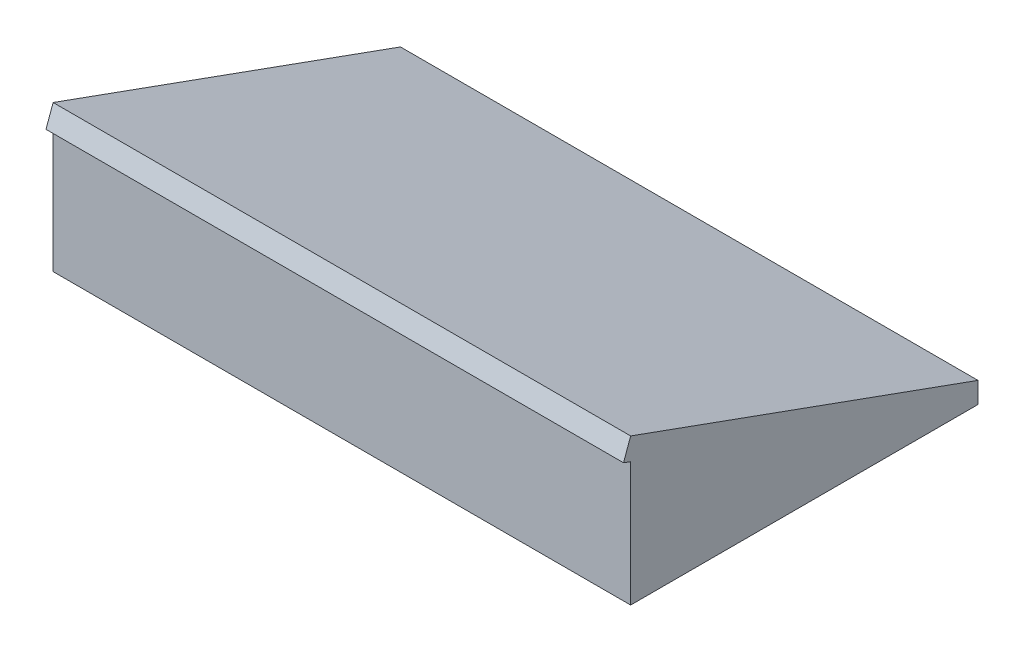
ISO-10303-21;
HEADER;
FILE_DESCRIPTION(('STEP AP214'),'2;1');
FILE_NAME('part.step','',(''),(''),'','','');
FILE_SCHEMA(('AUTOMOTIVE_DESIGN { 1 0 10303 214 1 1 1 1 }'));
ENDSEC;
DATA;
#1=APPLICATION_CONTEXT('core data for automotive mechanical design processes');
#2=APPLICATION_PROTOCOL_DEFINITION('international standard','automotive_design',2000,#1);
#3=PRODUCT_CONTEXT('',#1,'mechanical');
#4=PRODUCT('Part','Part','',(#3));
#5=PRODUCT_RELATED_PRODUCT_CATEGORY('part','',(#4));
#6=PRODUCT_DEFINITION_FORMATION('','',#4);
#7=PRODUCT_DEFINITION_CONTEXT('part definition',#1,'design');
#8=PRODUCT_DEFINITION('design','',#6,#7);
#9=PRODUCT_DEFINITION_SHAPE('','',#8);
#10=(LENGTH_UNIT() NAMED_UNIT(*) SI_UNIT(.MILLI.,.METRE.));
#11=(NAMED_UNIT(*) PLANE_ANGLE_UNIT() SI_UNIT($,.RADIAN.));
#12=(NAMED_UNIT(*) SI_UNIT($,.STERADIAN.) SOLID_ANGLE_UNIT());
#13=UNCERTAINTY_MEASURE_WITH_UNIT(LENGTH_MEASURE(1.E-05),#10,'distance_accuracy_value','');
#14=(GEOMETRIC_REPRESENTATION_CONTEXT(3) GLOBAL_UNCERTAINTY_ASSIGNED_CONTEXT((#13)) GLOBAL_UNIT_ASSIGNED_CONTEXT((#10,
#11,#12)) REPRESENTATION_CONTEXT('',''));
#15=CARTESIAN_POINT('',(0.,0.,0.));
#16=DIRECTION('',(0.,0.,1.));
#17=DIRECTION('',(1.,0.,0.));
#18=AXIS2_PLACEMENT_3D('',#15,#16,#17);
#19=CARTESIAN_POINT('',(64.,5.,41.5));
#20=DIRECTION('',(0.,0.,1.));
#21=DIRECTION('',(1.,0.,0.));
#22=AXIS2_PLACEMENT_3D('',#19,#20,#21);
#23=PLANE('',#22);
#24=DIRECTION('',(0.,-1.,0.));
#25=VECTOR('',#24,1.);
#26=CARTESIAN_POINT('',(69.,5.,41.5));
#27=LINE('',#26,#25);
#28=CARTESIAN_POINT('',(69.,29.6834149725969,41.5));
#29=VERTEX_POINT('',#28);
#30=CARTESIAN_POINT('',(69.,0.,41.5));
#31=VERTEX_POINT('',#30);
#32=EDGE_CURVE('E174',#29,#31,#27,.T.);
#33=ORIENTED_EDGE('',*,*,#32,.F.);
#34=DIRECTION('',(-1.,0.,0.));
#35=VECTOR('',#34,1.);
#36=CARTESIAN_POINT('',(64.,29.6834149725969,41.5));
#37=LINE('',#36,#35);
#38=CARTESIAN_POINT('',(-69.,29.6834149725969,41.5));
#39=VERTEX_POINT('',#38);
#40=EDGE_CURVE('E138',#29,#39,#37,.T.);
#41=ORIENTED_EDGE('',*,*,#40,.T.);
#42=DIRECTION('',(0.,-1.,0.));
#43=VECTOR('',#42,1.);
#44=CARTESIAN_POINT('',(-69.,5.,41.5));
#45=LINE('',#44,#43);
#46=CARTESIAN_POINT('',(-69.,0.,41.5));
#47=VERTEX_POINT('',#46);
#48=EDGE_CURVE('E113',#39,#47,#45,.T.);
#49=ORIENTED_EDGE('',*,*,#48,.T.);
#50=DIRECTION('',(1.,0.,0.));
#51=VECTOR('',#50,1.);
#52=CARTESIAN_POINT('',(-69.,0.,41.5));
#53=LINE('',#52,#51);
#54=EDGE_CURVE('E151',#47,#31,#53,.T.);
#55=ORIENTED_EDGE('',*,*,#54,.T.);
#56=EDGE_LOOP('',(#33,#41,#49,#55));
#57=FACE_BOUND('',#56,.T.);
#58=ADVANCED_FACE('F34',(#57),#23,.T.);
#59=CARTESIAN_POINT('',(64.,35.,41.5));
#60=DIRECTION('',(0.,0.940453312460655,-0.339922884021923));
#61=DIRECTION('',(0.,0.339922884021923,0.940453312460655));
#62=AXIS2_PLACEMENT_3D('',#59,#60,#61);
#63=PLANE('',#62);
#64=DIRECTION('',(0.,0.339922884021923,0.940453312460655));
#65=VECTOR('',#64,1.);
#66=CARTESIAN_POINT('',(69.,35.,41.5));
#67=LINE('',#66,#65);
#68=CARTESIAN_POINT('',(69.,5.,-41.5));
#69=VERTEX_POINT('',#68);
#70=CARTESIAN_POINT('',(69.,35.,41.5));
#71=VERTEX_POINT('',#70);
#72=EDGE_CURVE('E57',#69,#71,#67,.T.);
#73=ORIENTED_EDGE('',*,*,#72,.F.);
#74=DIRECTION('',(1.,0.,0.));
#75=VECTOR('',#74,1.);
#76=CARTESIAN_POINT('',(64.,5.,-41.5));
#77=LINE('',#76,#75);
#78=CARTESIAN_POINT('',(-69.,5.,-41.5));
#79=VERTEX_POINT('',#78);
#80=EDGE_CURVE('E173',#79,#69,#77,.T.);
#81=ORIENTED_EDGE('',*,*,#80,.F.);
#82=DIRECTION('',(0.,-0.339922884021923,-0.940453312460655));
#83=VECTOR('',#82,1.);
#84=CARTESIAN_POINT('',(-69.,35.,41.5));
#85=LINE('',#84,#83);
#86=CARTESIAN_POINT('',(-69.,35.,41.5));
#87=VERTEX_POINT('',#86);
#88=EDGE_CURVE('E140',#87,#79,#85,.T.);
#89=ORIENTED_EDGE('',*,*,#88,.F.);
#90=DIRECTION('',(1.,0.,0.));
#91=VECTOR('',#90,1.);
#92=CARTESIAN_POINT('',(64.,35.,41.5));
#93=LINE('',#92,#91);
#94=EDGE_CURVE('E43',#87,#71,#93,.T.);
#95=ORIENTED_EDGE('',*,*,#94,.T.);
#96=EDGE_LOOP('',(#73,#81,#89,#95));
#97=FACE_BOUND('',#96,.T.);
#98=ADVANCED_FACE('F36',(#97),#63,.T.);
#99=CARTESIAN_POINT('',(69.,0.,0.));
#100=DIRECTION('',(-1.,0.,0.));
#101=DIRECTION('',(0.,0.,1.));
#102=AXIS2_PLACEMENT_3D('',#99,#100,#101);
#103=PLANE('',#102);
#104=DIRECTION('',(0.,-1.,0.));
#105=VECTOR('',#104,1.);
#106=CARTESIAN_POINT('',(69.,5.,-41.5));
#107=LINE('',#106,#105);
#108=CARTESIAN_POINT('',(69.,0.,-41.5));
#109=VERTEX_POINT('',#108);
#110=EDGE_CURVE('E158',#69,#109,#107,.T.);
#111=ORIENTED_EDGE('',*,*,#110,.F.);
#112=ORIENTED_EDGE('',*,*,#72,.T.);
#113=DIRECTION('',(0.,0.940453312460655,-0.339922884021923));
#114=VECTOR('',#113,1.);
#115=CARTESIAN_POINT('',(69.,30.2977334376967,43.1996144201096));
#116=LINE('',#115,#114);
#117=CARTESIAN_POINT('',(69.,30.2977334376967,43.1996144201096));
#118=VERTEX_POINT('',#117);
#119=EDGE_CURVE('E123',#118,#71,#116,.T.);
#120=ORIENTED_EDGE('',*,*,#119,.F.);
#121=DIRECTION('',(0.,-0.339922884021923,-0.940453312460655));
#122=VECTOR('',#121,1.);
#123=CARTESIAN_POINT('',(69.,30.2977334376967,43.1996144201096));
#124=LINE('',#123,#122);
#125=EDGE_CURVE('E118',#118,#29,#124,.T.);
#126=ORIENTED_EDGE('',*,*,#125,.T.);
#127=ORIENTED_EDGE('',*,*,#32,.T.);
#128=DIRECTION('',(0.,0.,-1.));
#129=VECTOR('',#128,1.);
#130=CARTESIAN_POINT('',(69.,0.,41.5));
#131=LINE('',#130,#129);
#132=EDGE_CURVE('E143',#31,#109,#131,.T.);
#133=ORIENTED_EDGE('',*,*,#132,.T.);
#134=EDGE_LOOP('',(#111,#112,#120,#126,#127,#133));
#135=FACE_BOUND('',#134,.T.);
#136=ADVANCED_FACE('F182',(#135),#103,.F.);
#137=CARTESIAN_POINT('',(-69.,5.,-41.5));
#138=DIRECTION('',(0.,0.,1.));
#139=DIRECTION('',(1.,0.,0.));
#140=AXIS2_PLACEMENT_3D('',#137,#138,#139);
#141=PLANE('',#140);
#142=DIRECTION('',(-1.,0.,0.));
#143=VECTOR('',#142,1.);
#144=CARTESIAN_POINT('',(-69.,0.,-41.5));
#145=LINE('',#144,#143);
#146=CARTESIAN_POINT('',(-69.,0.,-41.5));
#147=VERTEX_POINT('',#146);
#148=EDGE_CURVE('E147',#109,#147,#145,.T.);
#149=ORIENTED_EDGE('',*,*,#148,.T.);
#150=DIRECTION('',(0.,-1.,0.));
#151=VECTOR('',#150,1.);
#152=CARTESIAN_POINT('',(-69.,5.,-41.5));
#153=LINE('',#152,#151);
#154=EDGE_CURVE('E155',#79,#147,#153,.T.);
#155=ORIENTED_EDGE('',*,*,#154,.F.);
#156=ORIENTED_EDGE('',*,*,#80,.T.);
#157=ORIENTED_EDGE('',*,*,#110,.T.);
#158=EDGE_LOOP('',(#149,#155,#156,#157));
#159=FACE_BOUND('',#158,.T.);
#160=ADVANCED_FACE('F180',(#159),#141,.F.);
#161=CARTESIAN_POINT('',(-69.,5.,41.5));
#162=DIRECTION('',(1.,0.,0.));
#163=DIRECTION('',(0.,0.,-1.));
#164=AXIS2_PLACEMENT_3D('',#161,#162,#163);
#165=PLANE('',#164);
#166=ORIENTED_EDGE('',*,*,#88,.T.);
#167=ORIENTED_EDGE('',*,*,#154,.T.);
#168=DIRECTION('',(0.,0.,1.));
#169=VECTOR('',#168,1.);
#170=CARTESIAN_POINT('',(-69.,0.,41.5));
#171=LINE('',#170,#169);
#172=EDGE_CURVE('E149',#147,#47,#171,.T.);
#173=ORIENTED_EDGE('',*,*,#172,.T.);
#174=ORIENTED_EDGE('',*,*,#48,.F.);
#175=DIRECTION('',(0.,0.339922884021923,0.940453312460655));
#176=VECTOR('',#175,1.);
#177=CARTESIAN_POINT('',(-69.,30.2977334376967,43.1996144201096));
#178=LINE('',#177,#176);
#179=CARTESIAN_POINT('',(-69.,30.2977334376967,43.1996144201096));
#180=VERTEX_POINT('',#179);
#181=EDGE_CURVE('E106',#39,#180,#178,.T.);
#182=ORIENTED_EDGE('',*,*,#181,.T.);
#183=DIRECTION('',(0.,0.940453312460655,-0.339922884021923));
#184=VECTOR('',#183,1.);
#185=CARTESIAN_POINT('',(-69.,30.2977334376967,43.1996144201096));
#186=LINE('',#185,#184);
#187=EDGE_CURVE('E110',#180,#87,#186,.T.);
#188=ORIENTED_EDGE('',*,*,#187,.T.);
#189=EDGE_LOOP('',(#166,#167,#173,#174,#182,#188));
#190=FACE_BOUND('',#189,.T.);
#191=ADVANCED_FACE('F109',(#190),#165,.F.);
#192=CARTESIAN_POINT('',(0.,0.,0.));
#193=DIRECTION('',(0.,-1.,0.));
#194=DIRECTION('',(0.,0.,-1.));
#195=AXIS2_PLACEMENT_3D('',#192,#193,#194);
#196=PLANE('',#195);
#197=ORIENTED_EDGE('',*,*,#132,.F.);
#198=ORIENTED_EDGE('',*,*,#54,.F.);
#199=ORIENTED_EDGE('',*,*,#172,.F.);
#200=ORIENTED_EDGE('',*,*,#148,.F.);
#201=EDGE_LOOP('',(#197,#198,#199,#200));
#202=FACE_BOUND('',#201,.T.);
#203=ADVANCED_FACE('F187',(#202),#196,.T.);
#204=CARTESIAN_POINT('',(69.,30.2977334376967,43.1996144201096));
#205=DIRECTION('',(0.,0.339922884021923,0.940453312460655));
#206=DIRECTION('',(0.,-0.940453312460655,0.339922884021923));
#207=AXIS2_PLACEMENT_3D('',#204,#205,#206);
#208=PLANE('',#207);
#209=ORIENTED_EDGE('',*,*,#94,.F.);
#210=ORIENTED_EDGE('',*,*,#187,.F.);
#211=DIRECTION('',(1.,0.,0.));
#212=VECTOR('',#211,1.);
#213=CARTESIAN_POINT('',(69.,30.2977334376967,43.1996144201096));
#214=LINE('',#213,#212);
#215=EDGE_CURVE('E117',#180,#118,#214,.T.);
#216=ORIENTED_EDGE('',*,*,#215,.T.);
#217=ORIENTED_EDGE('',*,*,#119,.T.);
#218=EDGE_LOOP('',(#209,#210,#216,#217));
#219=FACE_BOUND('',#218,.T.);
#220=ADVANCED_FACE('F122',(#219),#208,.T.);
#221=CARTESIAN_POINT('',(0.,12.9867820960611,-4.69401762508232));
#222=DIRECTION('',(0.,0.940453312460655,-0.339922884021923));
#223=DIRECTION('',(0.,0.339922884021923,0.940453312460655));
#224=AXIS2_PLACEMENT_3D('',#221,#222,#223);
#225=PLANE('',#224);
#226=ORIENTED_EDGE('',*,*,#40,.F.);
#227=ORIENTED_EDGE('',*,*,#125,.F.);
#228=ORIENTED_EDGE('',*,*,#215,.F.);
#229=ORIENTED_EDGE('',*,*,#181,.F.);
#230=EDGE_LOOP('',(#226,#227,#228,#229));
#231=FACE_BOUND('',#230,.T.);
#232=ADVANCED_FACE('F126',(#231),#225,.F.);
#233=CLOSED_SHELL('',(#58,#98,#136,#160,#191,#203,#220,#232));
#234=CARTESIAN_POINT('',(-64.,0.,0.));
#235=DIRECTION('',(1.,0.,0.));
#236=DIRECTION('',(0.,0.,-1.));
#237=AXIS2_PLACEMENT_3D('',#234,#235,#236);
#238=PLANE('',#237);
#239=DIRECTION('',(0.,0.,1.));
#240=VECTOR('',#239,1.);
#241=CARTESIAN_POINT('',(-64.,5.,41.5));
#242=LINE('',#241,#240);
#243=CARTESIAN_POINT('',(-64.,5.,-26.7907814241847));
#244=VERTEX_POINT('',#243);
#245=CARTESIAN_POINT('',(-64.,5.,36.5));
#246=VERTEX_POINT('',#245);
#247=EDGE_CURVE('E141',#244,#246,#242,.T.);
#248=ORIENTED_EDGE('',*,*,#247,.F.);
#249=DIRECTION('',(0.,0.339922884021923,0.940453312460655));
#250=VECTOR('',#249,1.);
#251=CARTESIAN_POINT('',(-64.,12.9867820960611,-4.69401762508232));
#252=LINE('',#251,#250);
#253=CARTESIAN_POINT('',(-64.,27.8761860569342,36.5));
#254=VERTEX_POINT('',#253);
#255=EDGE_CURVE('E11',#244,#254,#252,.T.);
#256=ORIENTED_EDGE('',*,*,#255,.T.);
#257=DIRECTION('',(0.,-1.,0.));
#258=VECTOR('',#257,1.);
#259=CARTESIAN_POINT('',(-64.,5.,36.5));
#260=LINE('',#259,#258);
#261=EDGE_CURVE('E161',#254,#246,#260,.T.);
#262=ORIENTED_EDGE('',*,*,#261,.T.);
#263=EDGE_LOOP('',(#248,#256,#262));
#264=FACE_BOUND('',#263,.T.);
#265=ADVANCED_FACE('F218',(#264),#238,.T.);
#266=CARTESIAN_POINT('',(0.,5.,0.));
#267=DIRECTION('',(0.,-1.,0.));
#268=DIRECTION('',(0.,0.,-1.));
#269=AXIS2_PLACEMENT_3D('',#266,#267,#268);
#270=PLANE('',#269);
#271=DIRECTION('',(1.,0.,0.));
#272=VECTOR('',#271,1.);
#273=CARTESIAN_POINT('',(0.,5.,-26.7907814241847));
#274=LINE('',#273,#272);
#275=CARTESIAN_POINT('',(64.,5.,-26.7907814241847));
#276=VERTEX_POINT('',#275);
#277=EDGE_CURVE('E131',#244,#276,#274,.T.);
#278=ORIENTED_EDGE('',*,*,#277,.F.);
#279=ORIENTED_EDGE('',*,*,#247,.T.);
#280=DIRECTION('',(1.,0.,0.));
#281=VECTOR('',#280,1.);
#282=CARTESIAN_POINT('',(-64.,5.,36.5));
#283=LINE('',#282,#281);
#284=CARTESIAN_POINT('',(64.,5.,36.5));
#285=VERTEX_POINT('',#284);
#286=EDGE_CURVE('E164',#246,#285,#283,.T.);
#287=ORIENTED_EDGE('',*,*,#286,.T.);
#288=DIRECTION('',(0.,0.,-1.));
#289=VECTOR('',#288,1.);
#290=CARTESIAN_POINT('',(64.,5.,-41.5));
#291=LINE('',#290,#289);
#292=EDGE_CURVE('E170',#285,#276,#291,.T.);
#293=ORIENTED_EDGE('',*,*,#292,.T.);
#294=EDGE_LOOP('',(#278,#279,#287,#293));
#295=FACE_BOUND('',#294,.T.);
#296=ADVANCED_FACE('F208',(#295),#270,.F.);
#297=CARTESIAN_POINT('',(0.,0.,36.5));
#298=DIRECTION('',(0.,0.,-1.));
#299=DIRECTION('',(-1.,0.,0.));
#300=AXIS2_PLACEMENT_3D('',#297,#298,#299);
#301=PLANE('',#300);
#302=ORIENTED_EDGE('',*,*,#261,.F.);
#303=DIRECTION('',(1.,0.,0.));
#304=VECTOR('',#303,1.);
#305=CARTESIAN_POINT('',(0.,27.8761860569342,36.5));
#306=LINE('',#305,#304);
#307=CARTESIAN_POINT('',(64.,27.8761860569342,36.5));
#308=VERTEX_POINT('',#307);
#309=EDGE_CURVE('E50',#254,#308,#306,.T.);
#310=ORIENTED_EDGE('',*,*,#309,.T.);
#311=DIRECTION('',(0.,1.,0.));
#312=VECTOR('',#311,1.);
#313=CARTESIAN_POINT('',(64.,5.,36.5));
#314=LINE('',#313,#312);
#315=EDGE_CURVE('E167',#285,#308,#314,.T.);
#316=ORIENTED_EDGE('',*,*,#315,.F.);
#317=ORIENTED_EDGE('',*,*,#286,.F.);
#318=EDGE_LOOP('',(#302,#310,#316,#317));
#319=FACE_BOUND('',#318,.T.);
#320=ADVANCED_FACE('F203',(#319),#301,.T.);
#321=CARTESIAN_POINT('',(64.,0.,0.));
#322=DIRECTION('',(-1.,0.,0.));
#323=DIRECTION('',(0.,0.,1.));
#324=AXIS2_PLACEMENT_3D('',#321,#322,#323);
#325=PLANE('',#324);
#326=ORIENTED_EDGE('',*,*,#315,.T.);
#327=DIRECTION('',(0.,-0.339922884021923,-0.940453312460655));
#328=VECTOR('',#327,1.);
#329=CARTESIAN_POINT('',(64.,12.9867820960611,-4.69401762508232));
#330=LINE('',#329,#328);
#331=EDGE_CURVE('E135',#308,#276,#330,.T.);
#332=ORIENTED_EDGE('',*,*,#331,.T.);
#333=ORIENTED_EDGE('',*,*,#292,.F.);
#334=EDGE_LOOP('',(#326,#332,#333));
#335=FACE_BOUND('',#334,.T.);
#336=ADVANCED_FACE('F199',(#335),#325,.T.);
#337=ORIENTED_EDGE('',*,*,#331,.F.);
#338=ORIENTED_EDGE('',*,*,#309,.F.);
#339=ORIENTED_EDGE('',*,*,#255,.F.);
#340=ORIENTED_EDGE('',*,*,#277,.T.);
#341=EDGE_LOOP('',(#337,#338,#339,#340));
#342=FACE_BOUND('',#341,.T.);
#343=ADVANCED_FACE('F202',(#342),#225,.F.);
#344=CLOSED_SHELL('',(#265,#296,#320,#336,#343));
#345=ORIENTED_CLOSED_SHELL('',*,#344,.T.);
#346=BREP_WITH_VOIDS('B2',#233,(#345));
#347=ADVANCED_BREP_SHAPE_REPRESENTATION('',(#18,#346),#14);
#348=SHAPE_DEFINITION_REPRESENTATION(#9,#347);
ENDSEC;
END-ISO-10303-21;
